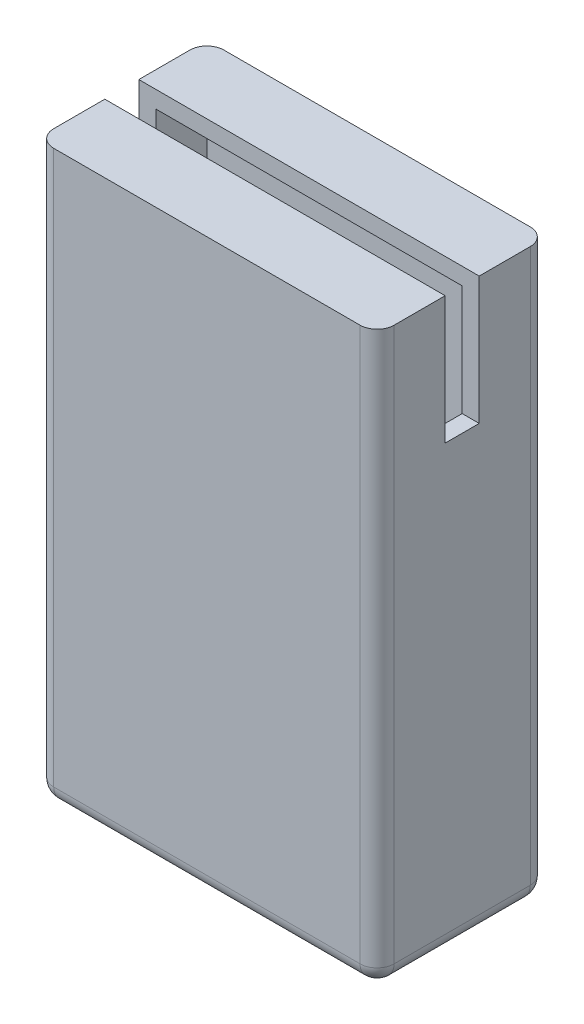
ISO-10303-21;
HEADER;
FILE_DESCRIPTION(('STEP AP214'),'2;1');
FILE_NAME('part.step','',(''),(''),'','','');
FILE_SCHEMA(('AUTOMOTIVE_DESIGN { 1 0 10303 214 1 1 1 1 }'));
ENDSEC;
DATA;
#1=APPLICATION_CONTEXT('core data for automotive mechanical design processes');
#2=APPLICATION_PROTOCOL_DEFINITION('international standard','automotive_design',2000,#1);
#3=PRODUCT_CONTEXT('',#1,'mechanical');
#4=PRODUCT('Part','Part','',(#3));
#5=PRODUCT_RELATED_PRODUCT_CATEGORY('part','',(#4));
#6=PRODUCT_DEFINITION_FORMATION('','',#4);
#7=PRODUCT_DEFINITION_CONTEXT('part definition',#1,'design');
#8=PRODUCT_DEFINITION('design','',#6,#7);
#9=PRODUCT_DEFINITION_SHAPE('','',#8);
#10=(LENGTH_UNIT() NAMED_UNIT(*) SI_UNIT(.MILLI.,.METRE.));
#11=(NAMED_UNIT(*) PLANE_ANGLE_UNIT() SI_UNIT($,.RADIAN.));
#12=(NAMED_UNIT(*) SI_UNIT($,.STERADIAN.) SOLID_ANGLE_UNIT());
#13=UNCERTAINTY_MEASURE_WITH_UNIT(LENGTH_MEASURE(1.E-05),#10,'distance_accuracy_value','');
#14=(GEOMETRIC_REPRESENTATION_CONTEXT(3) GLOBAL_UNCERTAINTY_ASSIGNED_CONTEXT((#13)) GLOBAL_UNIT_ASSIGNED_CONTEXT((#10,
#11,#12)) REPRESENTATION_CONTEXT('',''));
#15=CARTESIAN_POINT('',(0.,0.,0.));
#16=DIRECTION('',(0.,0.,1.));
#17=DIRECTION('',(1.,0.,0.));
#18=AXIS2_PLACEMENT_3D('',#15,#16,#17);
#19=CARTESIAN_POINT('',(-20.,33.5,20.));
#20=DIRECTION('',(0.,-1.,0.));
#21=DIRECTION('',(0.,0.,-1.));
#22=AXIS2_PLACEMENT_3D('',#19,#20,#21);
#23=PLANE('',#22);
#24=DIRECTION('',(0.,0.,-1.));
#25=VECTOR('',#24,1.);
#26=CARTESIAN_POINT('',(-20.,33.5,20.));
#27=LINE('',#26,#25);
#28=CARTESIAN_POINT('',(-20.,33.5,8.));
#29=VERTEX_POINT('',#28);
#30=CARTESIAN_POINT('',(-20.,33.5,2.));
#31=VERTEX_POINT('',#30);
#32=EDGE_CURVE('E269',#29,#31,#27,.T.);
#33=ORIENTED_EDGE('',*,*,#32,.F.);
#34=DIRECTION('',(-1.,0.,0.));
#35=VECTOR('',#34,1.);
#36=CARTESIAN_POINT('',(-20.,33.5,8.));
#37=LINE('',#36,#35);
#38=CARTESIAN_POINT('',(20.,33.5,8.));
#39=VERTEX_POINT('',#38);
#40=EDGE_CURVE('E197',#39,#29,#37,.T.);
#41=ORIENTED_EDGE('',*,*,#40,.F.);
#42=DIRECTION('',(0.,0.,-1.));
#43=VECTOR('',#42,1.);
#44=CARTESIAN_POINT('',(20.,33.5,20.));
#45=LINE('',#44,#43);
#46=CARTESIAN_POINT('',(20.,33.5,2.));
#47=VERTEX_POINT('',#46);
#48=EDGE_CURVE('E277',#39,#47,#45,.T.);
#49=ORIENTED_EDGE('',*,*,#48,.T.);
#50=CARTESIAN_POINT('',(18.,33.5,2.));
#51=DIRECTION('',(0.,-1.,0.));
#52=DIRECTION('',(0.,0.,-1.));
#53=AXIS2_PLACEMENT_3D('',#50,#51,#52);
#54=CIRCLE('',#53,2.);
#55=CARTESIAN_POINT('',(18.,33.5,0.));
#56=VERTEX_POINT('',#55);
#57=EDGE_CURVE('E319',#47,#56,#54,.F.);
#58=ORIENTED_EDGE('',*,*,#57,.T.);
#59=DIRECTION('',(-1.,0.,0.));
#60=VECTOR('',#59,1.);
#61=CARTESIAN_POINT('',(-20.,33.5,0.));
#62=LINE('',#61,#60);
#63=CARTESIAN_POINT('',(-18.,33.5,0.));
#64=VERTEX_POINT('',#63);
#65=EDGE_CURVE('E270',#56,#64,#62,.T.);
#66=ORIENTED_EDGE('',*,*,#65,.T.);
#67=CARTESIAN_POINT('',(-18.,33.5,2.));
#68=DIRECTION('',(0.,-1.,0.));
#69=DIRECTION('',(0.,0.,-1.));
#70=AXIS2_PLACEMENT_3D('',#67,#68,#69);
#71=CIRCLE('',#70,2.);
#72=EDGE_CURVE('E322',#64,#31,#71,.F.);
#73=ORIENTED_EDGE('',*,*,#72,.T.);
#74=EDGE_LOOP('',(#33,#41,#49,#58,#66,#73));
#75=FACE_BOUND('',#74,.T.);
#76=ADVANCED_FACE('F45',(#75),#23,.F.);
#77=CARTESIAN_POINT('',(-20.,31.5,20.));
#78=DIRECTION('',(0.,-1.,0.));
#79=DIRECTION('',(0.,0.,-1.));
#80=AXIS2_PLACEMENT_3D('',#77,#78,#79);
#81=PLANE('',#80);
#82=DIRECTION('',(1.,0.,0.));
#83=VECTOR('',#82,1.);
#84=CARTESIAN_POINT('',(-20.,31.5,8.));
#85=LINE('',#84,#83);
#86=CARTESIAN_POINT('',(-18.,31.5,8.));
#87=VERTEX_POINT('',#86);
#88=CARTESIAN_POINT('',(18.,31.5,8.));
#89=VERTEX_POINT('',#88);
#90=EDGE_CURVE('E225',#87,#89,#85,.T.);
#91=ORIENTED_EDGE('',*,*,#90,.F.);
#92=DIRECTION('',(0.,0.,-1.));
#93=VECTOR('',#92,1.);
#94=CARTESIAN_POINT('',(-18.,31.5,20.));
#95=LINE('',#94,#93);
#96=CARTESIAN_POINT('',(-18.,31.5,2.));
#97=VERTEX_POINT('',#96);
#98=EDGE_CURVE('E252',#87,#97,#95,.T.);
#99=ORIENTED_EDGE('',*,*,#98,.T.);
#100=DIRECTION('',(-1.,0.,0.));
#101=VECTOR('',#100,1.);
#102=CARTESIAN_POINT('',(0.,31.5,2.));
#103=LINE('',#102,#101);
#104=CARTESIAN_POINT('',(18.,31.5,2.));
#105=VERTEX_POINT('',#104);
#106=EDGE_CURVE('E231',#105,#97,#103,.T.);
#107=ORIENTED_EDGE('',*,*,#106,.F.);
#108=DIRECTION('',(0.,0.,-1.));
#109=VECTOR('',#108,1.);
#110=CARTESIAN_POINT('',(18.,31.5,20.));
#111=LINE('',#110,#109);
#112=EDGE_CURVE('E243',#89,#105,#111,.T.);
#113=ORIENTED_EDGE('',*,*,#112,.F.);
#114=EDGE_LOOP('',(#91,#99,#107,#113));
#115=FACE_BOUND('',#114,.T.);
#116=ADVANCED_FACE('F482',(#115),#81,.T.);
#117=CARTESIAN_POINT('',(20.,-33.5,20.));
#118=DIRECTION('',(-1.,0.,0.));
#119=DIRECTION('',(0.,0.,1.));
#120=AXIS2_PLACEMENT_3D('',#117,#118,#119);
#121=PLANE('',#120);
#122=ORIENTED_EDGE('',*,*,#48,.F.);
#123=DIRECTION('',(0.,1.,0.));
#124=VECTOR('',#123,1.);
#125=CARTESIAN_POINT('',(20.,18.5,8.));
#126=LINE('',#125,#124);
#127=CARTESIAN_POINT('',(20.,18.5,8.));
#128=VERTEX_POINT('',#127);
#129=EDGE_CURVE('E210',#128,#39,#126,.T.);
#130=ORIENTED_EDGE('',*,*,#129,.F.);
#131=DIRECTION('',(0.,0.,-1.));
#132=VECTOR('',#131,1.);
#133=CARTESIAN_POINT('',(20.,18.5,12.));
#134=LINE('',#133,#132);
#135=CARTESIAN_POINT('',(20.,18.5,12.));
#136=VERTEX_POINT('',#135);
#137=EDGE_CURVE('E188',#136,#128,#134,.T.);
#138=ORIENTED_EDGE('',*,*,#137,.F.);
#139=DIRECTION('',(0.,1.,0.));
#140=VECTOR('',#139,1.);
#141=CARTESIAN_POINT('',(20.,18.5,12.));
#142=LINE('',#141,#140);
#143=CARTESIAN_POINT('',(20.,33.5,12.));
#144=VERTEX_POINT('',#143);
#145=EDGE_CURVE('E204',#136,#144,#142,.T.);
#146=ORIENTED_EDGE('',*,*,#145,.T.);
#147=CARTESIAN_POINT('',(20.,33.5,18.));
#148=VERTEX_POINT('',#147);
#149=EDGE_CURVE('E278',#148,#144,#45,.T.);
#150=ORIENTED_EDGE('',*,*,#149,.F.);
#151=DIRECTION('',(0.,1.,0.));
#152=VECTOR('',#151,1.);
#153=CARTESIAN_POINT('',(20.,-33.5,18.));
#154=LINE('',#153,#152);
#155=CARTESIAN_POINT('',(20.,-31.5,18.));
#156=VERTEX_POINT('',#155);
#157=EDGE_CURVE('E341',#148,#156,#154,.F.);
#158=ORIENTED_EDGE('',*,*,#157,.T.);
#159=DIRECTION('',(0.,0.,-1.));
#160=VECTOR('',#159,1.);
#161=CARTESIAN_POINT('',(20.,-31.5,20.));
#162=LINE('',#161,#160);
#163=CARTESIAN_POINT('',(20.,-31.5,2.));
#164=VERTEX_POINT('',#163);
#165=EDGE_CURVE('E338',#156,#164,#162,.T.);
#166=ORIENTED_EDGE('',*,*,#165,.T.);
#167=DIRECTION('',(0.,1.,0.));
#168=VECTOR('',#167,1.);
#169=CARTESIAN_POINT('',(20.,33.5,2.));
#170=LINE('',#169,#168);
#171=EDGE_CURVE('E344',#164,#47,#170,.T.);
#172=ORIENTED_EDGE('',*,*,#171,.T.);
#173=EDGE_LOOP('',(#122,#130,#138,#146,#150,#158,#166,#172));
#174=FACE_BOUND('',#173,.T.);
#175=ADVANCED_FACE('F424',(#174),#121,.F.);
#176=ORIENTED_EDGE('',*,*,#149,.T.);
#177=DIRECTION('',(1.,0.,0.));
#178=VECTOR('',#177,1.);
#179=CARTESIAN_POINT('',(-20.,33.5,12.));
#180=LINE('',#179,#178);
#181=CARTESIAN_POINT('',(-20.,33.5,12.));
#182=VERTEX_POINT('',#181);
#183=EDGE_CURVE('E409',#182,#144,#180,.T.);
#184=ORIENTED_EDGE('',*,*,#183,.F.);
#185=CARTESIAN_POINT('',(-20.,33.5,18.));
#186=VERTEX_POINT('',#185);
#187=EDGE_CURVE('E202',#186,#182,#27,.T.);
#188=ORIENTED_EDGE('',*,*,#187,.F.);
#189=CARTESIAN_POINT('',(-18.,33.5,18.));
#190=DIRECTION('',(0.,-1.,0.));
#191=DIRECTION('',(0.,0.,-1.));
#192=AXIS2_PLACEMENT_3D('',#189,#190,#191);
#193=CIRCLE('',#192,2.);
#194=CARTESIAN_POINT('',(-18.,33.5,20.));
#195=VERTEX_POINT('',#194);
#196=EDGE_CURVE('E326',#186,#195,#193,.F.);
#197=ORIENTED_EDGE('',*,*,#196,.T.);
#198=DIRECTION('',(-1.,0.,0.));
#199=VECTOR('',#198,1.);
#200=CARTESIAN_POINT('',(-20.,33.5,20.));
#201=LINE('',#200,#199);
#202=CARTESIAN_POINT('',(18.,33.5,20.));
#203=VERTEX_POINT('',#202);
#204=EDGE_CURVE('E265',#203,#195,#201,.T.);
#205=ORIENTED_EDGE('',*,*,#204,.F.);
#206=CARTESIAN_POINT('',(18.,33.5,18.));
#207=DIRECTION('',(0.,-1.,0.));
#208=DIRECTION('',(0.,0.,-1.));
#209=AXIS2_PLACEMENT_3D('',#206,#207,#208);
#210=CIRCLE('',#209,2.);
#211=EDGE_CURVE('E316',#203,#148,#210,.F.);
#212=ORIENTED_EDGE('',*,*,#211,.T.);
#213=EDGE_LOOP('',(#176,#184,#188,#197,#205,#212));
#214=FACE_BOUND('',#213,.T.);
#215=ADVANCED_FACE('F453',(#214),#23,.F.);
#216=CARTESIAN_POINT('',(-20.,-33.5,20.));
#217=DIRECTION('',(1.,0.,0.));
#218=DIRECTION('',(0.,0.,-1.));
#219=AXIS2_PLACEMENT_3D('',#216,#217,#218);
#220=PLANE('',#219);
#221=DIRECTION('',(0.,0.,1.));
#222=VECTOR('',#221,1.);
#223=CARTESIAN_POINT('',(-20.,18.5,12.));
#224=LINE('',#223,#222);
#225=CARTESIAN_POINT('',(-20.,18.5,8.));
#226=VERTEX_POINT('',#225);
#227=CARTESIAN_POINT('',(-20.,18.5,12.));
#228=VERTEX_POINT('',#227);
#229=EDGE_CURVE('E192',#226,#228,#224,.T.);
#230=ORIENTED_EDGE('',*,*,#229,.F.);
#231=DIRECTION('',(0.,1.,0.));
#232=VECTOR('',#231,1.);
#233=CARTESIAN_POINT('',(-20.,18.5,8.));
#234=LINE('',#233,#232);
#235=EDGE_CURVE('E61',#226,#29,#234,.T.);
#236=ORIENTED_EDGE('',*,*,#235,.T.);
#237=ORIENTED_EDGE('',*,*,#32,.T.);
#238=DIRECTION('',(0.,-1.,0.));
#239=VECTOR('',#238,1.);
#240=CARTESIAN_POINT('',(-20.,-33.5,2.));
#241=LINE('',#240,#239);
#242=CARTESIAN_POINT('',(-20.,-31.5,2.));
#243=VERTEX_POINT('',#242);
#244=EDGE_CURVE('E310',#31,#243,#241,.T.);
#245=ORIENTED_EDGE('',*,*,#244,.T.);
#246=DIRECTION('',(0.,0.,-1.));
#247=VECTOR('',#246,1.);
#248=CARTESIAN_POINT('',(-20.,-31.5,20.));
#249=LINE('',#248,#247);
#250=CARTESIAN_POINT('',(-20.,-31.5,18.));
#251=VERTEX_POINT('',#250);
#252=EDGE_CURVE('E307',#243,#251,#249,.F.);
#253=ORIENTED_EDGE('',*,*,#252,.T.);
#254=DIRECTION('',(0.,-1.,0.));
#255=VECTOR('',#254,1.);
#256=CARTESIAN_POINT('',(-20.,-33.5,18.));
#257=LINE('',#256,#255);
#258=EDGE_CURVE('E313',#251,#186,#257,.F.);
#259=ORIENTED_EDGE('',*,*,#258,.T.);
#260=ORIENTED_EDGE('',*,*,#187,.T.);
#261=DIRECTION('',(0.,1.,0.));
#262=VECTOR('',#261,1.);
#263=CARTESIAN_POINT('',(-20.,18.5,12.));
#264=LINE('',#263,#262);
#265=EDGE_CURVE('E183',#228,#182,#264,.T.);
#266=ORIENTED_EDGE('',*,*,#265,.F.);
#267=EDGE_LOOP('',(#230,#236,#237,#245,#253,#259,#260,#266));
#268=FACE_BOUND('',#267,.T.);
#269=ADVANCED_FACE('F200',(#268),#220,.F.);
#270=CARTESIAN_POINT('',(0.,0.,20.));
#271=DIRECTION('',(0.,0.,-1.));
#272=DIRECTION('',(-1.,0.,0.));
#273=AXIS2_PLACEMENT_3D('',#270,#271,#272);
#274=PLANE('',#273);
#275=ORIENTED_EDGE('',*,*,#204,.T.);
#276=DIRECTION('',(0.,-1.,0.));
#277=VECTOR('',#276,1.);
#278=CARTESIAN_POINT('',(-18.,0.,20.));
#279=LINE('',#278,#277);
#280=CARTESIAN_POINT('',(-18.,-31.5,20.));
#281=VERTEX_POINT('',#280);
#282=EDGE_CURVE('E289',#195,#281,#279,.T.);
#283=ORIENTED_EDGE('',*,*,#282,.T.);
#284=DIRECTION('',(1.,0.,0.));
#285=VECTOR('',#284,1.);
#286=CARTESIAN_POINT('',(0.,-31.5,20.));
#287=LINE('',#286,#285);
#288=CARTESIAN_POINT('',(18.,-31.5,20.));
#289=VERTEX_POINT('',#288);
#290=EDGE_CURVE('E285',#281,#289,#287,.T.);
#291=ORIENTED_EDGE('',*,*,#290,.T.);
#292=DIRECTION('',(0.,1.,0.));
#293=VECTOR('',#292,1.);
#294=CARTESIAN_POINT('',(18.,0.,20.));
#295=LINE('',#294,#293);
#296=EDGE_CURVE('E282',#289,#203,#295,.T.);
#297=ORIENTED_EDGE('',*,*,#296,.T.);
#298=EDGE_LOOP('',(#275,#283,#291,#297));
#299=FACE_BOUND('',#298,.T.);
#300=ADVANCED_FACE('F456',(#299),#274,.F.);
#301=CARTESIAN_POINT('',(0.,0.,0.));
#302=DIRECTION('',(0.,0.,-1.));
#303=DIRECTION('',(-1.,0.,0.));
#304=AXIS2_PLACEMENT_3D('',#301,#302,#303);
#305=PLANE('',#304);
#306=DIRECTION('',(1.,0.,0.));
#307=VECTOR('',#306,1.);
#308=CARTESIAN_POINT('',(-20.,-31.5,0.));
#309=LINE('',#308,#307);
#310=CARTESIAN_POINT('',(18.,-31.5,0.));
#311=VERTEX_POINT('',#310);
#312=CARTESIAN_POINT('',(-18.,-31.5,0.));
#313=VERTEX_POINT('',#312);
#314=EDGE_CURVE('E332',#311,#313,#309,.F.);
#315=ORIENTED_EDGE('',*,*,#314,.T.);
#316=DIRECTION('',(0.,-1.,0.));
#317=VECTOR('',#316,1.);
#318=CARTESIAN_POINT('',(-18.,33.5,0.));
#319=LINE('',#318,#317);
#320=EDGE_CURVE('E335',#313,#64,#319,.F.);
#321=ORIENTED_EDGE('',*,*,#320,.T.);
#322=ORIENTED_EDGE('',*,*,#65,.F.);
#323=DIRECTION('',(0.,1.,0.));
#324=VECTOR('',#323,1.);
#325=CARTESIAN_POINT('',(18.,-33.5,0.));
#326=LINE('',#325,#324);
#327=EDGE_CURVE('E329',#56,#311,#326,.F.);
#328=ORIENTED_EDGE('',*,*,#327,.T.);
#329=EDGE_LOOP('',(#315,#321,#322,#328));
#330=FACE_BOUND('',#329,.T.);
#331=ADVANCED_FACE('F611',(#330),#305,.T.);
#332=CARTESIAN_POINT('',(-18.,-33.5,2.));
#333=DIRECTION('',(0.,1.,0.));
#334=DIRECTION('',(0.,0.,1.));
#335=AXIS2_PLACEMENT_3D('',#332,#333,#334);
#336=CYLINDRICAL_SURFACE('',#335,2.);
#337=ORIENTED_EDGE('',*,*,#72,.F.);
#338=ORIENTED_EDGE('',*,*,#320,.F.);
#339=CARTESIAN_POINT('',(-18.,-31.5,2.));
#340=DIRECTION('',(0.,-1.,0.));
#341=DIRECTION('',(0.,0.,-1.));
#342=AXIS2_PLACEMENT_3D('',#339,#340,#341);
#343=CIRCLE('',#342,2.);
#344=EDGE_CURVE('E387',#243,#313,#343,.T.);
#345=ORIENTED_EDGE('',*,*,#344,.F.);
#346=ORIENTED_EDGE('',*,*,#244,.F.);
#347=EDGE_LOOP('',(#337,#338,#345,#346));
#348=FACE_BOUND('',#347,.T.);
#349=ADVANCED_FACE('F47',(#348),#336,.T.);
#350=CARTESIAN_POINT('',(18.,-33.5,2.));
#351=DIRECTION('',(0.,-1.,0.));
#352=DIRECTION('',(0.,0.,-1.));
#353=AXIS2_PLACEMENT_3D('',#350,#351,#352);
#354=CYLINDRICAL_SURFACE('',#353,2.);
#355=ORIENTED_EDGE('',*,*,#57,.F.);
#356=ORIENTED_EDGE('',*,*,#171,.F.);
#357=CARTESIAN_POINT('',(18.,-31.5,2.));
#358=DIRECTION('',(0.,-1.,0.));
#359=DIRECTION('',(0.,0.,-1.));
#360=AXIS2_PLACEMENT_3D('',#357,#358,#359);
#361=CIRCLE('',#360,2.);
#362=EDGE_CURVE('E383',#311,#164,#361,.T.);
#363=ORIENTED_EDGE('',*,*,#362,.F.);
#364=ORIENTED_EDGE('',*,*,#327,.F.);
#365=EDGE_LOOP('',(#355,#356,#363,#364));
#366=FACE_BOUND('',#365,.T.);
#367=ADVANCED_FACE('F629',(#366),#354,.T.);
#368=CARTESIAN_POINT('',(-20.,-31.5,2.));
#369=DIRECTION('',(-1.,0.,0.));
#370=DIRECTION('',(0.,0.,1.));
#371=AXIS2_PLACEMENT_3D('',#368,#369,#370);
#372=CYLINDRICAL_SURFACE('',#371,2.);
#373=CARTESIAN_POINT('',(-18.,-31.5,2.));
#374=DIRECTION('',(-1.,0.,0.));
#375=DIRECTION('',(0.,0.,1.));
#376=AXIS2_PLACEMENT_3D('',#373,#374,#375);
#377=CIRCLE('',#376,2.);
#378=CARTESIAN_POINT('',(-18.,-33.5,2.));
#379=VERTEX_POINT('',#378);
#380=EDGE_CURVE('E274',#313,#379,#377,.T.);
#381=ORIENTED_EDGE('',*,*,#380,.F.);
#382=ORIENTED_EDGE('',*,*,#314,.F.);
#383=CARTESIAN_POINT('',(18.,-31.5,2.));
#384=DIRECTION('',(1.,0.,0.));
#385=DIRECTION('',(0.,0.,-1.));
#386=AXIS2_PLACEMENT_3D('',#383,#384,#385);
#387=CIRCLE('',#386,2.);
#388=CARTESIAN_POINT('',(18.,-33.5,2.));
#389=VERTEX_POINT('',#388);
#390=EDGE_CURVE('E379',#389,#311,#387,.T.);
#391=ORIENTED_EDGE('',*,*,#390,.F.);
#392=DIRECTION('',(1.,0.,0.));
#393=VECTOR('',#392,1.);
#394=CARTESIAN_POINT('',(20.,-33.5,2.));
#395=LINE('',#394,#393);
#396=EDGE_CURVE('E295',#379,#389,#395,.T.);
#397=ORIENTED_EDGE('',*,*,#396,.F.);
#398=EDGE_LOOP('',(#381,#382,#391,#397));
#399=FACE_BOUND('',#398,.T.);
#400=ADVANCED_FACE('F637',(#399),#372,.T.);
#401=CARTESIAN_POINT('',(-18.,-31.5,2.));
#402=DIRECTION('',(0.,0.,-1.));
#403=DIRECTION('',(-1.,0.,0.));
#404=AXIS2_PLACEMENT_3D('',#401,#402,#403);
#405=SPHERICAL_SURFACE('',#404,2.);
#406=ORIENTED_EDGE('',*,*,#344,.T.);
#407=ORIENTED_EDGE('',*,*,#380,.T.);
#408=CARTESIAN_POINT('',(-18.,-31.5,2.));
#409=DIRECTION('',(0.,0.,-1.));
#410=DIRECTION('',(-1.,0.,0.));
#411=AXIS2_PLACEMENT_3D('',#408,#409,#410);
#412=CIRCLE('',#411,2.);
#413=EDGE_CURVE('E375',#243,#379,#412,.F.);
#414=ORIENTED_EDGE('',*,*,#413,.F.);
#415=EDGE_LOOP('',(#406,#407,#414));
#416=FACE_BOUND('',#415,.T.);
#417=ADVANCED_FACE('F439',(#416),#405,.T.);
#418=CARTESIAN_POINT('',(18.,-31.5,2.));
#419=DIRECTION('',(0.,0.,-1.));
#420=DIRECTION('',(-1.,0.,0.));
#421=AXIS2_PLACEMENT_3D('',#418,#419,#420);
#422=SPHERICAL_SURFACE('',#421,2.);
#423=ORIENTED_EDGE('',*,*,#390,.T.);
#424=ORIENTED_EDGE('',*,*,#362,.T.);
#425=CARTESIAN_POINT('',(18.,-31.5,2.));
#426=DIRECTION('',(0.,0.,-1.));
#427=DIRECTION('',(-1.,0.,0.));
#428=AXIS2_PLACEMENT_3D('',#425,#426,#427);
#429=CIRCLE('',#428,2.);
#430=EDGE_CURVE('E371',#389,#164,#429,.F.);
#431=ORIENTED_EDGE('',*,*,#430,.F.);
#432=EDGE_LOOP('',(#423,#424,#431));
#433=FACE_BOUND('',#432,.T.);
#434=ADVANCED_FACE('F657',(#433),#422,.T.);
#435=CARTESIAN_POINT('',(-18.,-31.5,20.));
#436=DIRECTION('',(0.,0.,-1.));
#437=DIRECTION('',(-1.,0.,0.));
#438=AXIS2_PLACEMENT_3D('',#435,#436,#437);
#439=CYLINDRICAL_SURFACE('',#438,2.);
#440=ORIENTED_EDGE('',*,*,#413,.T.);
#441=DIRECTION('',(0.,0.,-1.));
#442=VECTOR('',#441,1.);
#443=CARTESIAN_POINT('',(-18.,-33.5,20.));
#444=LINE('',#443,#442);
#445=CARTESIAN_POINT('',(-18.,-33.5,18.));
#446=VERTEX_POINT('',#445);
#447=EDGE_CURVE('E303',#446,#379,#444,.T.);
#448=ORIENTED_EDGE('',*,*,#447,.F.);
#449=CARTESIAN_POINT('',(-18.,-31.5,18.));
#450=DIRECTION('',(0.,0.,1.));
#451=DIRECTION('',(1.,0.,0.));
#452=AXIS2_PLACEMENT_3D('',#449,#450,#451);
#453=CIRCLE('',#452,2.);
#454=EDGE_CURVE('E367',#251,#446,#453,.T.);
#455=ORIENTED_EDGE('',*,*,#454,.F.);
#456=ORIENTED_EDGE('',*,*,#252,.F.);
#457=EDGE_LOOP('',(#440,#448,#455,#456));
#458=FACE_BOUND('',#457,.T.);
#459=ADVANCED_FACE('F443',(#458),#439,.T.);
#460=CARTESIAN_POINT('',(-18.,0.,18.));
#461=DIRECTION('',(0.,-1.,0.));
#462=DIRECTION('',(0.,0.,-1.));
#463=AXIS2_PLACEMENT_3D('',#460,#461,#462);
#464=CYLINDRICAL_SURFACE('',#463,2.);
#465=ORIENTED_EDGE('',*,*,#196,.F.);
#466=ORIENTED_EDGE('',*,*,#258,.F.);
#467=CARTESIAN_POINT('',(-18.,-31.5,18.));
#468=DIRECTION('',(0.,-1.,0.));
#469=DIRECTION('',(0.,0.,-1.));
#470=AXIS2_PLACEMENT_3D('',#467,#468,#469);
#471=CIRCLE('',#470,2.);
#472=EDGE_CURVE('E363',#281,#251,#471,.T.);
#473=ORIENTED_EDGE('',*,*,#472,.F.);
#474=ORIENTED_EDGE('',*,*,#282,.F.);
#475=EDGE_LOOP('',(#465,#466,#473,#474));
#476=FACE_BOUND('',#475,.T.);
#477=ADVANCED_FACE('F448',(#476),#464,.T.);
#478=CARTESIAN_POINT('',(18.,0.,18.));
#479=DIRECTION('',(0.,1.,0.));
#480=DIRECTION('',(0.,0.,1.));
#481=AXIS2_PLACEMENT_3D('',#478,#479,#480);
#482=CYLINDRICAL_SURFACE('',#481,2.);
#483=ORIENTED_EDGE('',*,*,#211,.F.);
#484=ORIENTED_EDGE('',*,*,#296,.F.);
#485=CARTESIAN_POINT('',(18.,-31.5,18.));
#486=DIRECTION('',(0.,-1.,0.));
#487=DIRECTION('',(0.,0.,-1.));
#488=AXIS2_PLACEMENT_3D('',#485,#486,#487);
#489=CIRCLE('',#488,2.);
#490=EDGE_CURVE('E359',#156,#289,#489,.T.);
#491=ORIENTED_EDGE('',*,*,#490,.F.);
#492=ORIENTED_EDGE('',*,*,#157,.F.);
#493=EDGE_LOOP('',(#483,#484,#491,#492));
#494=FACE_BOUND('',#493,.T.);
#495=ADVANCED_FACE('F461',(#494),#482,.T.);
#496=CARTESIAN_POINT('',(18.,-31.5,20.));
#497=DIRECTION('',(0.,0.,-1.));
#498=DIRECTION('',(-1.,0.,0.));
#499=AXIS2_PLACEMENT_3D('',#496,#497,#498);
#500=CYLINDRICAL_SURFACE('',#499,2.);
#501=ORIENTED_EDGE('',*,*,#430,.T.);
#502=ORIENTED_EDGE('',*,*,#165,.F.);
#503=CARTESIAN_POINT('',(18.,-31.5,18.));
#504=DIRECTION('',(0.,0.,1.));
#505=DIRECTION('',(1.,0.,0.));
#506=AXIS2_PLACEMENT_3D('',#503,#504,#505);
#507=CIRCLE('',#506,2.);
#508=CARTESIAN_POINT('',(18.,-33.5,18.));
#509=VERTEX_POINT('',#508);
#510=EDGE_CURVE('E355',#509,#156,#507,.T.);
#511=ORIENTED_EDGE('',*,*,#510,.F.);
#512=DIRECTION('',(0.,0.,-1.));
#513=VECTOR('',#512,1.);
#514=CARTESIAN_POINT('',(18.,-33.5,20.));
#515=LINE('',#514,#513);
#516=EDGE_CURVE('E292',#389,#509,#515,.F.);
#517=ORIENTED_EDGE('',*,*,#516,.F.);
#518=EDGE_LOOP('',(#501,#502,#511,#517));
#519=FACE_BOUND('',#518,.T.);
#520=ADVANCED_FACE('F494',(#519),#500,.T.);
#521=CARTESIAN_POINT('',(-18.,-31.5,18.));
#522=DIRECTION('',(-1.,0.,0.));
#523=DIRECTION('',(0.,0.,1.));
#524=AXIS2_PLACEMENT_3D('',#521,#522,#523);
#525=SPHERICAL_SURFACE('',#524,2.);
#526=ORIENTED_EDGE('',*,*,#472,.T.);
#527=ORIENTED_EDGE('',*,*,#454,.T.);
#528=CARTESIAN_POINT('',(-18.,-31.5,18.));
#529=DIRECTION('',(-1.,0.,0.));
#530=DIRECTION('',(0.,0.,1.));
#531=AXIS2_PLACEMENT_3D('',#528,#529,#530);
#532=CIRCLE('',#531,2.);
#533=EDGE_CURVE('E351',#281,#446,#532,.F.);
#534=ORIENTED_EDGE('',*,*,#533,.F.);
#535=EDGE_LOOP('',(#526,#527,#534));
#536=FACE_BOUND('',#535,.T.);
#537=ADVANCED_FACE('F501',(#536),#525,.T.);
#538=CARTESIAN_POINT('',(18.,-31.5,18.));
#539=DIRECTION('',(1.,0.,0.));
#540=DIRECTION('',(0.,0.,-1.));
#541=AXIS2_PLACEMENT_3D('',#538,#539,#540);
#542=SPHERICAL_SURFACE('',#541,2.);
#543=ORIENTED_EDGE('',*,*,#510,.T.);
#544=ORIENTED_EDGE('',*,*,#490,.T.);
#545=CARTESIAN_POINT('',(18.,-31.5,18.));
#546=DIRECTION('',(1.,0.,0.));
#547=DIRECTION('',(0.,0.,-1.));
#548=AXIS2_PLACEMENT_3D('',#545,#546,#547);
#549=CIRCLE('',#548,2.);
#550=EDGE_CURVE('E236',#509,#289,#549,.F.);
#551=ORIENTED_EDGE('',*,*,#550,.F.);
#552=EDGE_LOOP('',(#543,#544,#551));
#553=FACE_BOUND('',#552,.T.);
#554=ADVANCED_FACE('F499',(#553),#542,.T.);
#555=CARTESIAN_POINT('',(0.,-31.5,18.));
#556=DIRECTION('',(1.,0.,0.));
#557=DIRECTION('',(0.,0.,-1.));
#558=AXIS2_PLACEMENT_3D('',#555,#556,#557);
#559=CYLINDRICAL_SURFACE('',#558,2.);
#560=ORIENTED_EDGE('',*,*,#533,.T.);
#561=DIRECTION('',(1.,0.,0.));
#562=VECTOR('',#561,1.);
#563=CARTESIAN_POINT('',(-20.,-33.5,18.));
#564=LINE('',#563,#562);
#565=EDGE_CURVE('E299',#509,#446,#564,.F.);
#566=ORIENTED_EDGE('',*,*,#565,.F.);
#567=ORIENTED_EDGE('',*,*,#550,.T.);
#568=ORIENTED_EDGE('',*,*,#290,.F.);
#569=EDGE_LOOP('',(#560,#566,#567,#568));
#570=FACE_BOUND('',#569,.T.);
#571=ADVANCED_FACE('F498',(#570),#559,.T.);
#572=CARTESIAN_POINT('',(18.,-33.5,20.));
#573=DIRECTION('',(-1.,0.,0.));
#574=DIRECTION('',(0.,0.,1.));
#575=AXIS2_PLACEMENT_3D('',#572,#573,#574);
#576=PLANE('',#575);
#577=DIRECTION('',(0.,-1.,0.));
#578=VECTOR('',#577,1.);
#579=CARTESIAN_POINT('',(18.,-33.5,8.));
#580=LINE('',#579,#578);
#581=CARTESIAN_POINT('',(18.,18.5,8.));
#582=VERTEX_POINT('',#581);
#583=EDGE_CURVE('E228',#89,#582,#580,.T.);
#584=ORIENTED_EDGE('',*,*,#583,.F.);
#585=ORIENTED_EDGE('',*,*,#112,.T.);
#586=DIRECTION('',(0.,1.,0.));
#587=VECTOR('',#586,1.);
#588=CARTESIAN_POINT('',(18.,0.,2.));
#589=LINE('',#588,#587);
#590=EDGE_CURVE('E232',#389,#105,#589,.T.);
#591=ORIENTED_EDGE('',*,*,#590,.F.);
#592=ORIENTED_EDGE('',*,*,#516,.T.);
#593=DIRECTION('',(0.,1.,0.));
#594=VECTOR('',#593,1.);
#595=CARTESIAN_POINT('',(18.,0.,18.));
#596=LINE('',#595,#594);
#597=CARTESIAN_POINT('',(18.,31.5,18.));
#598=VERTEX_POINT('',#597);
#599=EDGE_CURVE('E242',#509,#598,#596,.T.);
#600=ORIENTED_EDGE('',*,*,#599,.T.);
#601=CARTESIAN_POINT('',(18.,31.5,12.));
#602=VERTEX_POINT('',#601);
#603=EDGE_CURVE('E238',#598,#602,#111,.T.);
#604=ORIENTED_EDGE('',*,*,#603,.T.);
#605=DIRECTION('',(0.,1.,0.));
#606=VECTOR('',#605,1.);
#607=CARTESIAN_POINT('',(18.,-33.5,12.));
#608=LINE('',#607,#606);
#609=CARTESIAN_POINT('',(18.,18.5,12.));
#610=VERTEX_POINT('',#609);
#611=EDGE_CURVE('E222',#610,#602,#608,.T.);
#612=ORIENTED_EDGE('',*,*,#611,.F.);
#613=DIRECTION('',(0.,0.,1.));
#614=VECTOR('',#613,1.);
#615=CARTESIAN_POINT('',(18.,18.5,20.));
#616=LINE('',#615,#614);
#617=EDGE_CURVE('E216',#582,#610,#616,.T.);
#618=ORIENTED_EDGE('',*,*,#617,.F.);
#619=EDGE_LOOP('',(#584,#585,#591,#592,#600,#604,#612,#618));
#620=FACE_BOUND('',#619,.T.);
#621=ADVANCED_FACE('F469',(#620),#576,.T.);
#622=DIRECTION('',(-1.,0.,0.));
#623=VECTOR('',#622,1.);
#624=CARTESIAN_POINT('',(-20.,31.5,12.));
#625=LINE('',#624,#623);
#626=CARTESIAN_POINT('',(-18.,31.5,12.));
#627=VERTEX_POINT('',#626);
#628=EDGE_CURVE('E219',#602,#627,#625,.T.);
#629=ORIENTED_EDGE('',*,*,#628,.F.);
#630=ORIENTED_EDGE('',*,*,#603,.F.);
#631=DIRECTION('',(-1.,0.,0.));
#632=VECTOR('',#631,1.);
#633=CARTESIAN_POINT('',(0.,31.5,18.));
#634=LINE('',#633,#632);
#635=CARTESIAN_POINT('',(-18.,31.5,18.));
#636=VERTEX_POINT('',#635);
#637=EDGE_CURVE('E253',#598,#636,#634,.T.);
#638=ORIENTED_EDGE('',*,*,#637,.T.);
#639=EDGE_CURVE('E248',#636,#627,#95,.T.);
#640=ORIENTED_EDGE('',*,*,#639,.T.);
#641=EDGE_LOOP('',(#629,#630,#638,#640));
#642=FACE_BOUND('',#641,.T.);
#643=ADVANCED_FACE('F473',(#642),#81,.T.);
#644=CARTESIAN_POINT('',(-18.,-33.5,20.));
#645=DIRECTION('',(1.,0.,0.));
#646=DIRECTION('',(0.,0.,-1.));
#647=AXIS2_PLACEMENT_3D('',#644,#645,#646);
#648=PLANE('',#647);
#649=DIRECTION('',(0.,1.,0.));
#650=VECTOR('',#649,1.);
#651=CARTESIAN_POINT('',(-18.,-33.5,8.));
#652=LINE('',#651,#650);
#653=CARTESIAN_POINT('',(-18.,18.5,8.));
#654=VERTEX_POINT('',#653);
#655=EDGE_CURVE('E11',#654,#87,#652,.T.);
#656=ORIENTED_EDGE('',*,*,#655,.F.);
#657=DIRECTION('',(0.,0.,-1.));
#658=VECTOR('',#657,1.);
#659=CARTESIAN_POINT('',(-18.,18.5,20.));
#660=LINE('',#659,#658);
#661=CARTESIAN_POINT('',(-18.,18.5,12.));
#662=VERTEX_POINT('',#661);
#663=EDGE_CURVE('E348',#662,#654,#660,.T.);
#664=ORIENTED_EDGE('',*,*,#663,.F.);
#665=DIRECTION('',(0.,-1.,0.));
#666=VECTOR('',#665,1.);
#667=CARTESIAN_POINT('',(-18.,-33.5,12.));
#668=LINE('',#667,#666);
#669=EDGE_CURVE('E54',#627,#662,#668,.T.);
#670=ORIENTED_EDGE('',*,*,#669,.F.);
#671=ORIENTED_EDGE('',*,*,#639,.F.);
#672=DIRECTION('',(0.,1.,0.));
#673=VECTOR('',#672,1.);
#674=CARTESIAN_POINT('',(-18.,-33.5,18.));
#675=LINE('',#674,#673);
#676=EDGE_CURVE('E247',#446,#636,#675,.T.);
#677=ORIENTED_EDGE('',*,*,#676,.F.);
#678=ORIENTED_EDGE('',*,*,#447,.T.);
#679=DIRECTION('',(0.,1.,0.));
#680=VECTOR('',#679,1.);
#681=CARTESIAN_POINT('',(-18.,-33.5,2.));
#682=LINE('',#681,#680);
#683=EDGE_CURVE('E237',#379,#97,#682,.T.);
#684=ORIENTED_EDGE('',*,*,#683,.T.);
#685=ORIENTED_EDGE('',*,*,#98,.F.);
#686=EDGE_LOOP('',(#656,#664,#670,#671,#677,#678,#684,#685));
#687=FACE_BOUND('',#686,.T.);
#688=ADVANCED_FACE('F477',(#687),#648,.T.);
#689=CARTESIAN_POINT('',(0.,0.,18.));
#690=DIRECTION('',(0.,0.,-1.));
#691=DIRECTION('',(-1.,0.,0.));
#692=AXIS2_PLACEMENT_3D('',#689,#690,#691);
#693=PLANE('',#692);
#694=ORIENTED_EDGE('',*,*,#637,.F.);
#695=ORIENTED_EDGE('',*,*,#599,.F.);
#696=ORIENTED_EDGE('',*,*,#565,.T.);
#697=ORIENTED_EDGE('',*,*,#676,.T.);
#698=EDGE_LOOP('',(#694,#695,#696,#697));
#699=FACE_BOUND('',#698,.T.);
#700=ADVANCED_FACE('F492',(#699),#693,.T.);
#701=CARTESIAN_POINT('',(0.,0.,2.));
#702=DIRECTION('',(0.,0.,-1.));
#703=DIRECTION('',(-1.,0.,0.));
#704=AXIS2_PLACEMENT_3D('',#701,#702,#703);
#705=PLANE('',#704);
#706=ORIENTED_EDGE('',*,*,#396,.T.);
#707=ORIENTED_EDGE('',*,*,#590,.T.);
#708=ORIENTED_EDGE('',*,*,#106,.T.);
#709=ORIENTED_EDGE('',*,*,#683,.F.);
#710=EDGE_LOOP('',(#706,#707,#708,#709));
#711=FACE_BOUND('',#710,.T.);
#712=ADVANCED_FACE('F486',(#711),#705,.F.);
#713=CARTESIAN_POINT('',(0.,18.5,0.));
#714=DIRECTION('',(0.,-1.,0.));
#715=DIRECTION('',(0.,0.,-1.));
#716=AXIS2_PLACEMENT_3D('',#713,#714,#715);
#717=PLANE('',#716);
#718=ORIENTED_EDGE('',*,*,#617,.T.);
#719=DIRECTION('',(1.,0.,0.));
#720=VECTOR('',#719,1.);
#721=CARTESIAN_POINT('',(-20.,18.5,12.));
#722=LINE('',#721,#720);
#723=EDGE_CURVE('E189',#610,#136,#722,.T.);
#724=ORIENTED_EDGE('',*,*,#723,.T.);
#725=ORIENTED_EDGE('',*,*,#137,.T.);
#726=DIRECTION('',(-1.,0.,0.));
#727=VECTOR('',#726,1.);
#728=CARTESIAN_POINT('',(-20.,18.5,8.));
#729=LINE('',#728,#727);
#730=EDGE_CURVE('E205',#128,#582,#729,.T.);
#731=ORIENTED_EDGE('',*,*,#730,.T.);
#732=EDGE_LOOP('',(#718,#724,#725,#731));
#733=FACE_BOUND('',#732,.T.);
#734=ADVANCED_FACE('F416',(#733),#717,.F.);
#735=CARTESIAN_POINT('',(-20.,18.5,8.));
#736=DIRECTION('',(0.,0.,-1.));
#737=DIRECTION('',(-1.,0.,0.));
#738=AXIS2_PLACEMENT_3D('',#735,#736,#737);
#739=PLANE('',#738);
#740=ORIENTED_EDGE('',*,*,#583,.T.);
#741=ORIENTED_EDGE('',*,*,#730,.F.);
#742=ORIENTED_EDGE('',*,*,#129,.T.);
#743=ORIENTED_EDGE('',*,*,#40,.T.);
#744=ORIENTED_EDGE('',*,*,#235,.F.);
#745=EDGE_CURVE('E194',#654,#226,#729,.T.);
#746=ORIENTED_EDGE('',*,*,#745,.F.);
#747=ORIENTED_EDGE('',*,*,#655,.T.);
#748=ORIENTED_EDGE('',*,*,#90,.T.);
#749=EDGE_LOOP('',(#740,#741,#742,#743,#744,#746,#747,#748));
#750=FACE_BOUND('',#749,.T.);
#751=ADVANCED_FACE('F421',(#750),#739,.F.);
#752=CARTESIAN_POINT('',(-20.,18.5,12.));
#753=DIRECTION('',(0.,0.,1.));
#754=DIRECTION('',(1.,0.,0.));
#755=AXIS2_PLACEMENT_3D('',#752,#753,#754);
#756=PLANE('',#755);
#757=ORIENTED_EDGE('',*,*,#611,.T.);
#758=ORIENTED_EDGE('',*,*,#628,.T.);
#759=ORIENTED_EDGE('',*,*,#669,.T.);
#760=EDGE_CURVE('E69',#228,#662,#722,.T.);
#761=ORIENTED_EDGE('',*,*,#760,.F.);
#762=ORIENTED_EDGE('',*,*,#265,.T.);
#763=ORIENTED_EDGE('',*,*,#183,.T.);
#764=ORIENTED_EDGE('',*,*,#145,.F.);
#765=ORIENTED_EDGE('',*,*,#723,.F.);
#766=EDGE_LOOP('',(#757,#758,#759,#761,#762,#763,#764,#765));
#767=FACE_BOUND('',#766,.T.);
#768=ADVANCED_FACE('F181',(#767),#756,.F.);
#769=ORIENTED_EDGE('',*,*,#663,.T.);
#770=ORIENTED_EDGE('',*,*,#745,.T.);
#771=ORIENTED_EDGE('',*,*,#229,.T.);
#772=ORIENTED_EDGE('',*,*,#760,.T.);
#773=EDGE_LOOP('',(#769,#770,#771,#772));
#774=FACE_BOUND('',#773,.T.);
#775=ADVANCED_FACE('F193',(#774),#717,.F.);
#776=CLOSED_SHELL('',(#76,#116,#175,#215,#269,#300,#331,#349,#367,#400,#417,#434,#459,#477,#495,
#520,#537,#554,#571,#621,#643,#688,#700,#712,#734,#751,#768,#775));
#777=MANIFOLD_SOLID_BREP('B2',#776);
#778=ADVANCED_BREP_SHAPE_REPRESENTATION('',(#18,#777),#14);
#779=SHAPE_DEFINITION_REPRESENTATION(#9,#778);
ENDSEC;
END-ISO-10303-21;
